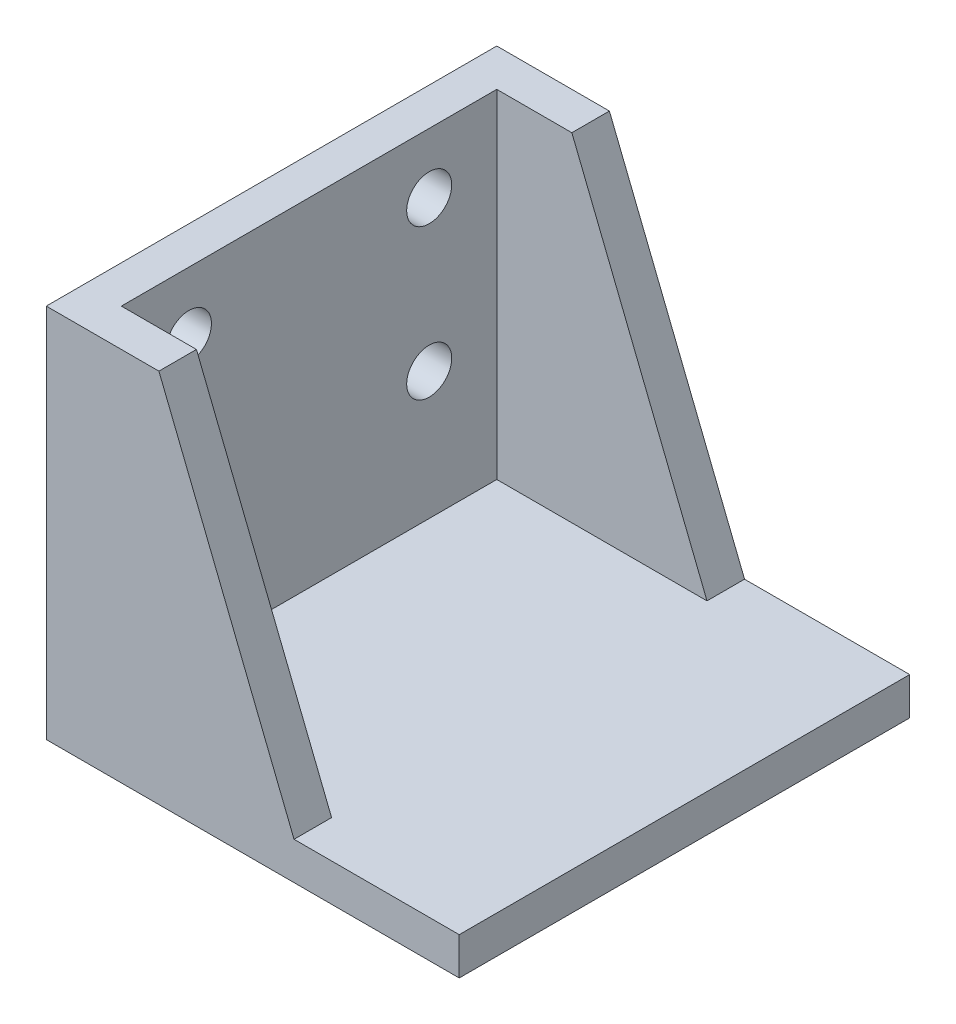
ISO-10303-21;
HEADER;
FILE_DESCRIPTION(('STEP AP214'),'2;1');
FILE_NAME('part.step','',(''),(''),'','','');
FILE_SCHEMA(('AUTOMOTIVE_DESIGN { 1 0 10303 214 1 1 1 1 }'));
ENDSEC;
DATA;
#1=APPLICATION_CONTEXT('core data for automotive mechanical design processes');
#2=APPLICATION_PROTOCOL_DEFINITION('international standard','automotive_design',2000,#1);
#3=PRODUCT_CONTEXT('',#1,'mechanical');
#4=PRODUCT('Part','Part','',(#3));
#5=PRODUCT_RELATED_PRODUCT_CATEGORY('part','',(#4));
#6=PRODUCT_DEFINITION_FORMATION('','',#4);
#7=PRODUCT_DEFINITION_CONTEXT('part definition',#1,'design');
#8=PRODUCT_DEFINITION('design','',#6,#7);
#9=PRODUCT_DEFINITION_SHAPE('','',#8);
#10=(LENGTH_UNIT() NAMED_UNIT(*) SI_UNIT(.MILLI.,.METRE.));
#11=(NAMED_UNIT(*) PLANE_ANGLE_UNIT() SI_UNIT($,.RADIAN.));
#12=(NAMED_UNIT(*) SI_UNIT($,.STERADIAN.) SOLID_ANGLE_UNIT());
#13=UNCERTAINTY_MEASURE_WITH_UNIT(LENGTH_MEASURE(1.E-05),#10,'distance_accuracy_value','');
#14=(GEOMETRIC_REPRESENTATION_CONTEXT(3) GLOBAL_UNCERTAINTY_ASSIGNED_CONTEXT((#13)) GLOBAL_UNIT_ASSIGNED_CONTEXT((#10,
#11,#12)) REPRESENTATION_CONTEXT('',''));
#15=CARTESIAN_POINT('',(0.,0.,0.));
#16=DIRECTION('',(0.,0.,1.));
#17=DIRECTION('',(1.,0.,0.));
#18=AXIS2_PLACEMENT_3D('',#15,#16,#17);
#19=CARTESIAN_POINT('',(-31.4893617021277,42.8723404255319,60.));
#20=DIRECTION('',(-0.928476690885259,-0.371390676354104,0.));
#21=DIRECTION('',(0.371390676354104,-0.928476690885259,0.));
#22=AXIS2_PLACEMENT_3D('',#19,#20,#21);
#23=PLANE('',#22);
#24=DIRECTION('',(0.,0.,1.));
#25=VECTOR('',#24,1.);
#26=CARTESIAN_POINT('',(-13.4893617021277,-2.12765957446807,60.));
#27=LINE('',#26,#25);
#28=CARTESIAN_POINT('',(-13.4893617021277,-2.12765957446807,0.));
#29=VERTEX_POINT('',#28);
#30=CARTESIAN_POINT('',(-13.4893617021277,-2.12765957446807,5.));
#31=VERTEX_POINT('',#30);
#32=EDGE_CURVE('E59',#29,#31,#27,.T.);
#33=ORIENTED_EDGE('',*,*,#32,.F.);
#34=DIRECTION('',(-0.371390676354104,0.928476690885259,0.));
#35=VECTOR('',#34,1.);
#36=CARTESIAN_POINT('',(-31.4893617021277,42.8723404255319,0.));
#37=LINE('',#36,#35);
#38=CARTESIAN_POINT('',(-31.4893617021277,42.8723404255319,0.));
#39=VERTEX_POINT('',#38);
#40=EDGE_CURVE('E137',#29,#39,#37,.T.);
#41=ORIENTED_EDGE('',*,*,#40,.T.);
#42=DIRECTION('',(0.,0.,-1.));
#43=VECTOR('',#42,1.);
#44=CARTESIAN_POINT('',(-31.4893617021277,42.8723404255319,60.));
#45=LINE('',#44,#43);
#46=CARTESIAN_POINT('',(-31.4893617021277,42.8723404255319,5.));
#47=VERTEX_POINT('',#46);
#48=EDGE_CURVE('E200',#47,#39,#45,.T.);
#49=ORIENTED_EDGE('',*,*,#48,.F.);
#50=DIRECTION('',(0.371390676354104,-0.928476690885259,0.));
#51=VECTOR('',#50,1.);
#52=CARTESIAN_POINT('',(-31.4893617021277,42.8723404255319,4.99999999999999));
#53=LINE('',#52,#51);
#54=EDGE_CURVE('E178',#47,#31,#53,.T.);
#55=ORIENTED_EDGE('',*,*,#54,.T.);
#56=EDGE_LOOP('',(#33,#41,#49,#55));
#57=FACE_BOUND('',#56,.T.);
#58=ADVANCED_FACE('F35',(#57),#23,.F.);
#59=CARTESIAN_POINT('',(-13.4893617021277,-2.12765957446807,55.));
#60=VERTEX_POINT('',#59);
#61=CARTESIAN_POINT('',(-13.4893617021277,-2.12765957446807,60.));
#62=VERTEX_POINT('',#61);
#63=EDGE_CURVE('E138',#60,#62,#27,.T.);
#64=ORIENTED_EDGE('',*,*,#63,.F.);
#65=DIRECTION('',(-0.371390676354104,0.928476690885259,0.));
#66=VECTOR('',#65,1.);
#67=CARTESIAN_POINT('',(-31.4893617021277,42.8723404255319,55.));
#68=LINE('',#67,#66);
#69=CARTESIAN_POINT('',(-31.4893617021277,42.8723404255319,55.));
#70=VERTEX_POINT('',#69);
#71=EDGE_CURVE('E173',#60,#70,#68,.T.);
#72=ORIENTED_EDGE('',*,*,#71,.T.);
#73=CARTESIAN_POINT('',(-31.4893617021277,42.8723404255319,60.));
#74=VERTEX_POINT('',#73);
#75=EDGE_CURVE('E43',#74,#70,#45,.T.);
#76=ORIENTED_EDGE('',*,*,#75,.F.);
#77=DIRECTION('',(-0.371390676354104,0.928476690885259,0.));
#78=VECTOR('',#77,1.);
#79=CARTESIAN_POINT('',(-31.4893617021277,42.8723404255319,60.));
#80=LINE('',#79,#78);
#81=EDGE_CURVE('E51',#62,#74,#80,.T.);
#82=ORIENTED_EDGE('',*,*,#81,.F.);
#83=EDGE_LOOP('',(#64,#72,#76,#82));
#84=FACE_BOUND('',#83,.T.);
#85=ADVANCED_FACE('F232',(#84),#23,.F.);
#86=CARTESIAN_POINT('',(-46.4893617021277,42.8723404255319,60.));
#87=DIRECTION('',(0.,-1.,0.));
#88=DIRECTION('',(0.,0.,-1.));
#89=AXIS2_PLACEMENT_3D('',#86,#87,#88);
#90=PLANE('',#89);
#91=DIRECTION('',(0.,0.,1.));
#92=VECTOR('',#91,1.);
#93=CARTESIAN_POINT('',(-41.4893617021277,42.8723404255319,55.));
#94=LINE('',#93,#92);
#95=CARTESIAN_POINT('',(-41.4893617021277,42.8723404255319,5.));
#96=VERTEX_POINT('',#95);
#97=CARTESIAN_POINT('',(-41.4893617021277,42.8723404255319,55.));
#98=VERTEX_POINT('',#97);
#99=EDGE_CURVE('E167',#96,#98,#94,.T.);
#100=ORIENTED_EDGE('',*,*,#99,.F.);
#101=DIRECTION('',(1.,0.,0.));
#102=VECTOR('',#101,1.);
#103=CARTESIAN_POINT('',(-46.4893617021277,42.8723404255319,5.));
#104=LINE('',#103,#102);
#105=EDGE_CURVE('E11',#96,#47,#104,.T.);
#106=ORIENTED_EDGE('',*,*,#105,.T.);
#107=ORIENTED_EDGE('',*,*,#48,.T.);
#108=DIRECTION('',(-1.,0.,0.));
#109=VECTOR('',#108,1.);
#110=CARTESIAN_POINT('',(-46.4893617021277,42.8723404255319,0.));
#111=LINE('',#110,#109);
#112=CARTESIAN_POINT('',(-46.4893617021277,42.8723404255319,0.));
#113=VERTEX_POINT('',#112);
#114=EDGE_CURVE('E190',#39,#113,#111,.T.);
#115=ORIENTED_EDGE('',*,*,#114,.T.);
#116=DIRECTION('',(0.,0.,-1.));
#117=VECTOR('',#116,1.);
#118=CARTESIAN_POINT('',(-46.4893617021277,42.8723404255319,60.));
#119=LINE('',#118,#117);
#120=CARTESIAN_POINT('',(-46.4893617021277,42.8723404255319,60.));
#121=VERTEX_POINT('',#120);
#122=EDGE_CURVE('E197',#121,#113,#119,.T.);
#123=ORIENTED_EDGE('',*,*,#122,.F.);
#124=DIRECTION('',(-1.,0.,0.));
#125=VECTOR('',#124,1.);
#126=CARTESIAN_POINT('',(-46.4893617021277,42.8723404255319,60.));
#127=LINE('',#126,#125);
#128=EDGE_CURVE('E181',#74,#121,#127,.T.);
#129=ORIENTED_EDGE('',*,*,#128,.F.);
#130=ORIENTED_EDGE('',*,*,#75,.T.);
#131=DIRECTION('',(1.,0.,0.));
#132=VECTOR('',#131,1.);
#133=CARTESIAN_POINT('',(-6.84445933843047,42.8723404255319,55.));
#134=LINE('',#133,#132);
#135=EDGE_CURVE('E161',#98,#70,#134,.T.);
#136=ORIENTED_EDGE('',*,*,#135,.F.);
#137=EDGE_LOOP('',(#100,#106,#107,#115,#123,#129,#130,#136));
#138=FACE_BOUND('',#137,.T.);
#139=ADVANCED_FACE('F236',(#138),#90,.F.);
#140=CARTESIAN_POINT('',(-46.4893617021277,-7.12765957446808,60.));
#141=DIRECTION('',(1.,0.,0.));
#142=DIRECTION('',(0.,0.,-1.));
#143=AXIS2_PLACEMENT_3D('',#140,#141,#142);
#144=PLANE('',#143);
#145=CARTESIAN_POINT('',(-46.4893617021277,14.8723404255319,14.));
#146=DIRECTION('',(-1.,0.,0.));
#147=DIRECTION('',(0.,0.,1.));
#148=AXIS2_PLACEMENT_3D('',#145,#146,#147);
#149=CIRCLE('',#148,3.);
#150=CARTESIAN_POINT('',(-46.4893617021277,14.8723404255319,17.));
#151=VERTEX_POINT('',#150);
#152=EDGE_CURVE('E148',#151,#151,#149,.T.);
#153=ORIENTED_EDGE('',*,*,#152,.F.);
#154=EDGE_LOOP('',(#153));
#155=FACE_BOUND('',#154,.T.);
#156=CARTESIAN_POINT('',(-46.4893617021277,34.8723404255319,46.));
#157=DIRECTION('',(-1.,0.,0.));
#158=DIRECTION('',(0.,0.,-1.));
#159=AXIS2_PLACEMENT_3D('',#156,#157,#158);
#160=CIRCLE('',#159,3.);
#161=CARTESIAN_POINT('',(-46.4893617021277,34.8723404255319,43.));
#162=VERTEX_POINT('',#161);
#163=EDGE_CURVE('E147',#162,#162,#160,.T.);
#164=ORIENTED_EDGE('',*,*,#163,.F.);
#165=EDGE_LOOP('',(#164));
#166=FACE_BOUND('',#165,.T.);
#167=CARTESIAN_POINT('',(-46.4893617021277,14.8723404255319,46.));
#168=DIRECTION('',(-1.,0.,0.));
#169=DIRECTION('',(0.,0.,-1.));
#170=AXIS2_PLACEMENT_3D('',#167,#168,#169);
#171=CIRCLE('',#170,3.);
#172=CARTESIAN_POINT('',(-46.4893617021277,14.8723404255319,43.));
#173=VERTEX_POINT('',#172);
#174=EDGE_CURVE('E144',#173,#173,#171,.T.);
#175=ORIENTED_EDGE('',*,*,#174,.F.);
#176=EDGE_LOOP('',(#175));
#177=FACE_BOUND('',#176,.T.);
#178=CARTESIAN_POINT('',(-46.4893617021277,34.8723404255319,14.));
#179=DIRECTION('',(-1.,0.,0.));
#180=DIRECTION('',(0.,0.,1.));
#181=AXIS2_PLACEMENT_3D('',#178,#179,#180);
#182=CIRCLE('',#181,3.);
#183=CARTESIAN_POINT('',(-46.4893617021277,34.8723404255319,17.));
#184=VERTEX_POINT('',#183);
#185=EDGE_CURVE('E151',#184,#184,#182,.T.);
#186=ORIENTED_EDGE('',*,*,#185,.F.);
#187=EDGE_LOOP('',(#186));
#188=FACE_BOUND('',#187,.T.);
#189=DIRECTION('',(0.,-1.,0.));
#190=VECTOR('',#189,1.);
#191=CARTESIAN_POINT('',(-46.4893617021277,-7.12765957446808,0.));
#192=LINE('',#191,#190);
#193=CARTESIAN_POINT('',(-46.4893617021277,-7.12765957446808,0.));
#194=VERTEX_POINT('',#193);
#195=EDGE_CURVE('E192',#113,#194,#192,.T.);
#196=ORIENTED_EDGE('',*,*,#195,.T.);
#197=DIRECTION('',(0.,0.,-1.));
#198=VECTOR('',#197,1.);
#199=CARTESIAN_POINT('',(-46.4893617021277,-7.12765957446808,60.));
#200=LINE('',#199,#198);
#201=CARTESIAN_POINT('',(-46.4893617021277,-7.12765957446808,60.));
#202=VERTEX_POINT('',#201);
#203=EDGE_CURVE('E188',#202,#194,#200,.T.);
#204=ORIENTED_EDGE('',*,*,#203,.F.);
#205=DIRECTION('',(0.,-1.,0.));
#206=VECTOR('',#205,1.);
#207=CARTESIAN_POINT('',(-46.4893617021277,-7.12765957446808,60.));
#208=LINE('',#207,#206);
#209=EDGE_CURVE('E184',#121,#202,#208,.T.);
#210=ORIENTED_EDGE('',*,*,#209,.F.);
#211=ORIENTED_EDGE('',*,*,#122,.T.);
#212=EDGE_LOOP('',(#196,#204,#210,#211));
#213=FACE_BOUND('',#212,.T.);
#214=ADVANCED_FACE('F241',(#155,#166,#177,#188,#213),#144,.F.);
#215=CARTESIAN_POINT('',(-11.4893617021277,-7.12765957446808,60.));
#216=DIRECTION('',(0.,1.,0.));
#217=DIRECTION('',(-1.,0.,0.));
#218=AXIS2_PLACEMENT_3D('',#215,#216,#217);
#219=PLANE('',#218);
#220=DIRECTION('',(1.,0.,0.));
#221=VECTOR('',#220,1.);
#222=CARTESIAN_POINT('',(-11.4893617021277,-7.12765957446808,0.));
#223=LINE('',#222,#221);
#224=CARTESIAN_POINT('',(8.51063829787233,-7.12765957446808,0.));
#225=VERTEX_POINT('',#224);
#226=EDGE_CURVE('E182',#194,#225,#223,.T.);
#227=ORIENTED_EDGE('',*,*,#226,.T.);
#228=DIRECTION('',(0.,0.,-1.));
#229=VECTOR('',#228,1.);
#230=CARTESIAN_POINT('',(8.51063829787233,-7.12765957446808,0.));
#231=LINE('',#230,#229);
#232=CARTESIAN_POINT('',(8.51063829787233,-7.12765957446808,60.));
#233=VERTEX_POINT('',#232);
#234=EDGE_CURVE('E131',#233,#225,#231,.T.);
#235=ORIENTED_EDGE('',*,*,#234,.F.);
#236=DIRECTION('',(1.,0.,0.));
#237=VECTOR('',#236,1.);
#238=CARTESIAN_POINT('',(-11.4893617021277,-7.12765957446808,60.));
#239=LINE('',#238,#237);
#240=EDGE_CURVE('E186',#202,#233,#239,.T.);
#241=ORIENTED_EDGE('',*,*,#240,.F.);
#242=ORIENTED_EDGE('',*,*,#203,.T.);
#243=EDGE_LOOP('',(#227,#235,#241,#242));
#244=FACE_BOUND('',#243,.T.);
#245=ADVANCED_FACE('F261',(#244),#219,.F.);
#246=CARTESIAN_POINT('',(0.,0.,60.));
#247=DIRECTION('',(0.,0.,-1.));
#248=DIRECTION('',(-1.,0.,0.));
#249=AXIS2_PLACEMENT_3D('',#246,#247,#248);
#250=PLANE('',#249);
#251=ORIENTED_EDGE('',*,*,#240,.T.);
#252=DIRECTION('',(0.,-1.,0.));
#253=VECTOR('',#252,1.);
#254=CARTESIAN_POINT('',(8.51063829787233,-7.12765957446808,60.));
#255=LINE('',#254,#253);
#256=CARTESIAN_POINT('',(8.51063829787233,-2.12765957446807,60.));
#257=VERTEX_POINT('',#256);
#258=EDGE_CURVE('E124',#257,#233,#255,.T.);
#259=ORIENTED_EDGE('',*,*,#258,.F.);
#260=DIRECTION('',(-1.,0.,0.));
#261=VECTOR('',#260,1.);
#262=CARTESIAN_POINT('',(8.51063829787233,-2.12765957446807,60.));
#263=LINE('',#262,#261);
#264=EDGE_CURVE('E120',#257,#62,#263,.T.);
#265=ORIENTED_EDGE('',*,*,#264,.T.);
#266=ORIENTED_EDGE('',*,*,#81,.T.);
#267=ORIENTED_EDGE('',*,*,#128,.T.);
#268=ORIENTED_EDGE('',*,*,#209,.T.);
#269=EDGE_LOOP('',(#251,#259,#265,#266,#267,#268));
#270=FACE_BOUND('',#269,.T.);
#271=ADVANCED_FACE('F256',(#270),#250,.F.);
#272=CARTESIAN_POINT('',(0.,0.,0.));
#273=DIRECTION('',(0.,0.,-1.));
#274=DIRECTION('',(-1.,0.,0.));
#275=AXIS2_PLACEMENT_3D('',#272,#273,#274);
#276=PLANE('',#275);
#277=ORIENTED_EDGE('',*,*,#40,.F.);
#278=DIRECTION('',(-1.,0.,0.));
#279=VECTOR('',#278,1.);
#280=CARTESIAN_POINT('',(8.51063829787233,-2.12765957446807,0.));
#281=LINE('',#280,#279);
#282=CARTESIAN_POINT('',(8.51063829787233,-2.12765957446807,0.));
#283=VERTEX_POINT('',#282);
#284=EDGE_CURVE('E118',#283,#29,#281,.T.);
#285=ORIENTED_EDGE('',*,*,#284,.F.);
#286=DIRECTION('',(0.,1.,0.));
#287=VECTOR('',#286,1.);
#288=CARTESIAN_POINT('',(8.51063829787233,-2.12765957446807,0.));
#289=LINE('',#288,#287);
#290=EDGE_CURVE('E125',#225,#283,#289,.T.);
#291=ORIENTED_EDGE('',*,*,#290,.F.);
#292=ORIENTED_EDGE('',*,*,#226,.F.);
#293=ORIENTED_EDGE('',*,*,#195,.F.);
#294=ORIENTED_EDGE('',*,*,#114,.F.);
#295=EDGE_LOOP('',(#277,#285,#291,#292,#293,#294));
#296=FACE_BOUND('',#295,.T.);
#297=ADVANCED_FACE('F135',(#296),#276,.T.);
#298=CARTESIAN_POINT('',(0.,-2.12765957446807,0.));
#299=DIRECTION('',(0.,-1.,0.));
#300=DIRECTION('',(0.,0.,-1.));
#301=AXIS2_PLACEMENT_3D('',#298,#299,#300);
#302=PLANE('',#301);
#303=DIRECTION('',(-1.,0.,0.));
#304=VECTOR('',#303,1.);
#305=CARTESIAN_POINT('',(-41.4893617021277,-2.12765957446807,5.));
#306=LINE('',#305,#304);
#307=CARTESIAN_POINT('',(-41.4893617021277,-2.12765957446807,5.));
#308=VERTEX_POINT('',#307);
#309=EDGE_CURVE('E164',#31,#308,#306,.T.);
#310=ORIENTED_EDGE('',*,*,#309,.T.);
#311=DIRECTION('',(0.,0.,1.));
#312=VECTOR('',#311,1.);
#313=CARTESIAN_POINT('',(-41.4893617021277,-2.12765957446807,55.));
#314=LINE('',#313,#312);
#315=CARTESIAN_POINT('',(-41.4893617021277,-2.12765957446807,55.));
#316=VERTEX_POINT('',#315);
#317=EDGE_CURVE('E157',#308,#316,#314,.T.);
#318=ORIENTED_EDGE('',*,*,#317,.T.);
#319=DIRECTION('',(1.,0.,0.));
#320=VECTOR('',#319,1.);
#321=CARTESIAN_POINT('',(-6.84445933843047,-2.12765957446807,55.));
#322=LINE('',#321,#320);
#323=EDGE_CURVE('E160',#316,#60,#322,.T.);
#324=ORIENTED_EDGE('',*,*,#323,.T.);
#325=ORIENTED_EDGE('',*,*,#63,.T.);
#326=ORIENTED_EDGE('',*,*,#264,.F.);
#327=DIRECTION('',(0.,0.,1.));
#328=VECTOR('',#327,1.);
#329=CARTESIAN_POINT('',(8.51063829787233,-2.12765957446807,60.));
#330=LINE('',#329,#328);
#331=EDGE_CURVE('E114',#283,#257,#330,.T.);
#332=ORIENTED_EDGE('',*,*,#331,.F.);
#333=ORIENTED_EDGE('',*,*,#284,.T.);
#334=ORIENTED_EDGE('',*,*,#32,.T.);
#335=EDGE_LOOP('',(#310,#318,#324,#325,#326,#332,#333,#334));
#336=FACE_BOUND('',#335,.T.);
#337=ADVANCED_FACE('F116',(#336),#302,.F.);
#338=CARTESIAN_POINT('',(-41.4893617021277,-2.12765957446807,5.));
#339=DIRECTION('',(0.,0.,-1.));
#340=DIRECTION('',(-1.,0.,0.));
#341=AXIS2_PLACEMENT_3D('',#338,#339,#340);
#342=PLANE('',#341);
#343=ORIENTED_EDGE('',*,*,#105,.F.);
#344=DIRECTION('',(0.,1.,0.));
#345=VECTOR('',#344,1.);
#346=CARTESIAN_POINT('',(-41.4893617021277,-2.12765957446807,5.));
#347=LINE('',#346,#345);
#348=EDGE_CURVE('E170',#308,#96,#347,.T.);
#349=ORIENTED_EDGE('',*,*,#348,.F.);
#350=ORIENTED_EDGE('',*,*,#309,.F.);
#351=ORIENTED_EDGE('',*,*,#54,.F.);
#352=EDGE_LOOP('',(#343,#349,#350,#351));
#353=FACE_BOUND('',#352,.T.);
#354=ADVANCED_FACE('F284',(#353),#342,.F.);
#355=CARTESIAN_POINT('',(-6.84445933843047,-2.12765957446807,55.));
#356=DIRECTION('',(0.,0.,1.));
#357=DIRECTION('',(1.,0.,0.));
#358=AXIS2_PLACEMENT_3D('',#355,#356,#357);
#359=PLANE('',#358);
#360=ORIENTED_EDGE('',*,*,#323,.F.);
#361=DIRECTION('',(0.,1.,0.));
#362=VECTOR('',#361,1.);
#363=CARTESIAN_POINT('',(-41.4893617021277,-2.12765957446807,55.));
#364=LINE('',#363,#362);
#365=EDGE_CURVE('E166',#316,#98,#364,.T.);
#366=ORIENTED_EDGE('',*,*,#365,.T.);
#367=ORIENTED_EDGE('',*,*,#135,.T.);
#368=ORIENTED_EDGE('',*,*,#71,.F.);
#369=EDGE_LOOP('',(#360,#366,#367,#368));
#370=FACE_BOUND('',#369,.T.);
#371=ADVANCED_FACE('F246',(#370),#359,.F.);
#372=CARTESIAN_POINT('',(-41.4893617021277,-2.12765957446807,55.));
#373=DIRECTION('',(-1.,0.,0.));
#374=DIRECTION('',(0.,0.,1.));
#375=AXIS2_PLACEMENT_3D('',#372,#373,#374);
#376=PLANE('',#375);
#377=CARTESIAN_POINT('',(-41.4893617021277,14.8723404255319,14.));
#378=DIRECTION('',(-1.,0.,0.));
#379=DIRECTION('',(0.,0.,1.));
#380=AXIS2_PLACEMENT_3D('',#377,#378,#379);
#381=CIRCLE('',#380,3.);
#382=CARTESIAN_POINT('',(-41.4893617021277,14.8723404255319,17.));
#383=VERTEX_POINT('',#382);
#384=EDGE_CURVE('E38',#383,#383,#381,.T.);
#385=ORIENTED_EDGE('',*,*,#384,.T.);
#386=EDGE_LOOP('',(#385));
#387=FACE_BOUND('',#386,.T.);
#388=CARTESIAN_POINT('',(-41.4893617021277,34.8723404255319,46.));
#389=DIRECTION('',(-1.,0.,0.));
#390=DIRECTION('',(0.,0.,1.));
#391=AXIS2_PLACEMENT_3D('',#388,#389,#390);
#392=CIRCLE('',#391,3.);
#393=CARTESIAN_POINT('',(-41.4893617021277,34.8723404255319,49.));
#394=VERTEX_POINT('',#393);
#395=EDGE_CURVE('E207',#394,#394,#392,.T.);
#396=ORIENTED_EDGE('',*,*,#395,.T.);
#397=EDGE_LOOP('',(#396));
#398=FACE_BOUND('',#397,.T.);
#399=CARTESIAN_POINT('',(-41.4893617021277,14.8723404255319,46.));
#400=DIRECTION('',(-1.,0.,0.));
#401=DIRECTION('',(0.,0.,1.));
#402=AXIS2_PLACEMENT_3D('',#399,#400,#401);
#403=CIRCLE('',#402,3.);
#404=CARTESIAN_POINT('',(-41.4893617021277,14.8723404255319,49.));
#405=VERTEX_POINT('',#404);
#406=EDGE_CURVE('E205',#405,#405,#403,.T.);
#407=ORIENTED_EDGE('',*,*,#406,.T.);
#408=EDGE_LOOP('',(#407));
#409=FACE_BOUND('',#408,.T.);
#410=CARTESIAN_POINT('',(-41.4893617021277,34.8723404255319,14.));
#411=DIRECTION('',(-1.,0.,0.));
#412=DIRECTION('',(0.,0.,1.));
#413=AXIS2_PLACEMENT_3D('',#410,#411,#412);
#414=CIRCLE('',#413,3.);
#415=CARTESIAN_POINT('',(-41.4893617021277,34.8723404255319,17.));
#416=VERTEX_POINT('',#415);
#417=EDGE_CURVE('E156',#416,#416,#414,.T.);
#418=ORIENTED_EDGE('',*,*,#417,.T.);
#419=EDGE_LOOP('',(#418));
#420=FACE_BOUND('',#419,.T.);
#421=ORIENTED_EDGE('',*,*,#99,.T.);
#422=ORIENTED_EDGE('',*,*,#365,.F.);
#423=ORIENTED_EDGE('',*,*,#317,.F.);
#424=ORIENTED_EDGE('',*,*,#348,.T.);
#425=EDGE_LOOP('',(#421,#422,#423,#424));
#426=FACE_BOUND('',#425,.T.);
#427=ADVANCED_FACE('F214',(#387,#398,#409,#420,#426),#376,.F.);
#428=CARTESIAN_POINT('',(-11.4893617021277,34.8723404255319,14.));
#429=DIRECTION('',(-1.,0.,0.));
#430=DIRECTION('',(0.,0.,1.));
#431=AXIS2_PLACEMENT_3D('',#428,#429,#430);
#432=CYLINDRICAL_SURFACE('',#431,3.);
#433=ORIENTED_EDGE('',*,*,#185,.T.);
#434=EDGE_LOOP('',(#433));
#435=FACE_BOUND('',#434,.T.);
#436=ORIENTED_EDGE('',*,*,#417,.F.);
#437=EDGE_LOOP('',(#436));
#438=FACE_BOUND('',#437,.T.);
#439=ADVANCED_FACE('F281',(#435,#438),#432,.F.);
#440=CARTESIAN_POINT('',(-11.4893617021277,14.8723404255319,46.));
#441=DIRECTION('',(-1.,0.,0.));
#442=DIRECTION('',(0.,0.,1.));
#443=AXIS2_PLACEMENT_3D('',#440,#441,#442);
#444=CYLINDRICAL_SURFACE('',#443,3.);
#445=ORIENTED_EDGE('',*,*,#174,.T.);
#446=EDGE_LOOP('',(#445));
#447=FACE_BOUND('',#446,.T.);
#448=ORIENTED_EDGE('',*,*,#406,.F.);
#449=EDGE_LOOP('',(#448));
#450=FACE_BOUND('',#449,.T.);
#451=ADVANCED_FACE('F227',(#447,#450),#444,.F.);
#452=CARTESIAN_POINT('',(-11.4893617021277,34.8723404255319,46.));
#453=DIRECTION('',(-1.,0.,0.));
#454=DIRECTION('',(0.,0.,1.));
#455=AXIS2_PLACEMENT_3D('',#452,#453,#454);
#456=CYLINDRICAL_SURFACE('',#455,3.);
#457=ORIENTED_EDGE('',*,*,#163,.T.);
#458=EDGE_LOOP('',(#457));
#459=FACE_BOUND('',#458,.T.);
#460=ORIENTED_EDGE('',*,*,#395,.F.);
#461=EDGE_LOOP('',(#460));
#462=FACE_BOUND('',#461,.T.);
#463=ADVANCED_FACE('F218',(#459,#462),#456,.F.);
#464=CARTESIAN_POINT('',(-11.4893617021277,14.8723404255319,14.));
#465=DIRECTION('',(-1.,0.,0.));
#466=DIRECTION('',(0.,0.,1.));
#467=AXIS2_PLACEMENT_3D('',#464,#465,#466);
#468=CYLINDRICAL_SURFACE('',#467,3.);
#469=ORIENTED_EDGE('',*,*,#152,.T.);
#470=EDGE_LOOP('',(#469));
#471=FACE_BOUND('',#470,.T.);
#472=ORIENTED_EDGE('',*,*,#384,.F.);
#473=EDGE_LOOP('',(#472));
#474=FACE_BOUND('',#473,.T.);
#475=ADVANCED_FACE('F216',(#471,#474),#468,.F.);
#476=CARTESIAN_POINT('',(8.51063829787233,0.,0.));
#477=DIRECTION('',(-1.,0.,0.));
#478=DIRECTION('',(0.,0.,1.));
#479=AXIS2_PLACEMENT_3D('',#476,#477,#478);
#480=PLANE('',#479);
#481=ORIENTED_EDGE('',*,*,#290,.T.);
#482=ORIENTED_EDGE('',*,*,#331,.T.);
#483=ORIENTED_EDGE('',*,*,#258,.T.);
#484=ORIENTED_EDGE('',*,*,#234,.T.);
#485=EDGE_LOOP('',(#481,#482,#483,#484));
#486=FACE_BOUND('',#485,.T.);
#487=ADVANCED_FACE('F129',(#486),#480,.F.);
#488=CLOSED_SHELL('',(#58,#85,#139,#214,#245,#271,#297,#337,#354,#371,#427,#439,#451,#463,#475,#487));
#489=MANIFOLD_SOLID_BREP('B2',#488);
#490=ADVANCED_BREP_SHAPE_REPRESENTATION('',(#18,#489),#14);
#491=SHAPE_DEFINITION_REPRESENTATION(#9,#490);
ENDSEC;
END-ISO-10303-21;
